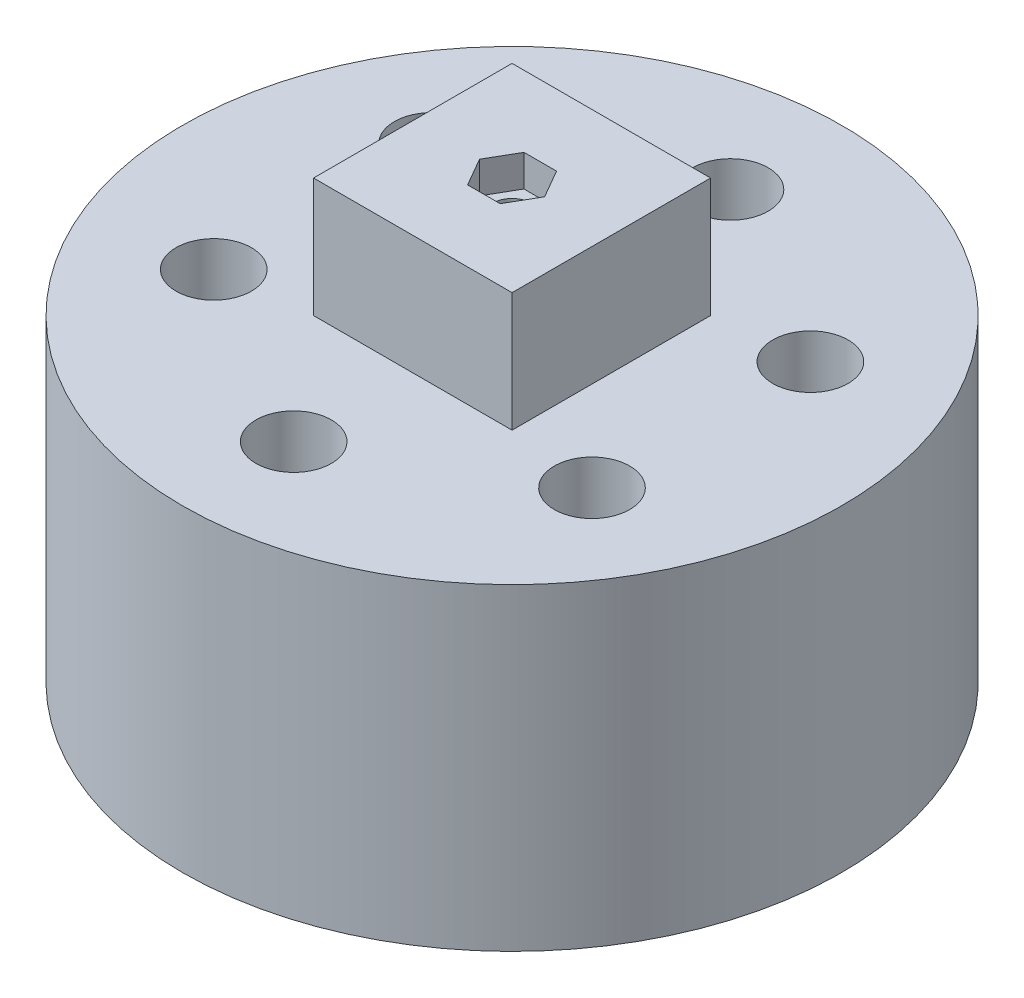
ISO-10303-21;
HEADER;
FILE_DESCRIPTION(('STEP AP214'),'2;1');
FILE_NAME('part.step','',(''),(''),'','','');
FILE_SCHEMA(('AUTOMOTIVE_DESIGN { 1 0 10303 214 1 1 1 1 }'));
ENDSEC;
DATA;
#1=APPLICATION_CONTEXT('core data for automotive mechanical design processes');
#2=APPLICATION_PROTOCOL_DEFINITION('international standard','automotive_design',2000,#1);
#3=PRODUCT_CONTEXT('',#1,'mechanical');
#4=PRODUCT('Part','Part','',(#3));
#5=PRODUCT_RELATED_PRODUCT_CATEGORY('part','',(#4));
#6=PRODUCT_DEFINITION_FORMATION('','',#4);
#7=PRODUCT_DEFINITION_CONTEXT('part definition',#1,'design');
#8=PRODUCT_DEFINITION('design','',#6,#7);
#9=PRODUCT_DEFINITION_SHAPE('','',#8);
#10=(LENGTH_UNIT() NAMED_UNIT(*) SI_UNIT(.MILLI.,.METRE.));
#11=(NAMED_UNIT(*) PLANE_ANGLE_UNIT() SI_UNIT($,.RADIAN.));
#12=(NAMED_UNIT(*) SI_UNIT($,.STERADIAN.) SOLID_ANGLE_UNIT());
#13=UNCERTAINTY_MEASURE_WITH_UNIT(LENGTH_MEASURE(1.E-05),#10,'distance_accuracy_value','');
#14=(GEOMETRIC_REPRESENTATION_CONTEXT(3) GLOBAL_UNCERTAINTY_ASSIGNED_CONTEXT((#13)) GLOBAL_UNIT_ASSIGNED_CONTEXT((#10,
#11,#12)) REPRESENTATION_CONTEXT('',''));
#15=CARTESIAN_POINT('',(0.,0.,0.));
#16=DIRECTION('',(0.,0.,1.));
#17=DIRECTION('',(1.,0.,0.));
#18=AXIS2_PLACEMENT_3D('',#15,#16,#17);
#19=CARTESIAN_POINT('',(0.,0.,0.));
#20=DIRECTION('',(0.,1.,0.));
#21=DIRECTION('',(0.,0.,1.));
#22=AXIS2_PLACEMENT_3D('',#19,#20,#21);
#23=CYLINDRICAL_SURFACE('',#22,2.5);
#24=CARTESIAN_POINT('',(0.,47.,0.));
#25=DIRECTION('',(0.,-1.,0.));
#26=DIRECTION('',(0.,0.,-1.));
#27=AXIS2_PLACEMENT_3D('',#24,#25,#26);
#28=CIRCLE('',#27,2.5);
#29=CARTESIAN_POINT('',(0.,47.,-2.5));
#30=VERTEX_POINT('',#29);
#31=EDGE_CURVE('E173',#30,#30,#28,.F.);
#32=ORIENTED_EDGE('',*,*,#31,.F.);
#33=EDGE_LOOP('',(#32));
#34=FACE_BOUND('',#33,.T.);
#35=CARTESIAN_POINT('',(0.,51.,0.));
#36=DIRECTION('',(0.,1.,0.));
#37=DIRECTION('',(0.,0.,1.));
#38=AXIS2_PLACEMENT_3D('',#35,#36,#37);
#39=CIRCLE('',#38,2.5);
#40=CARTESIAN_POINT('',(0.,51.,2.5));
#41=VERTEX_POINT('',#40);
#42=EDGE_CURVE('E38',#41,#41,#39,.F.);
#43=ORIENTED_EDGE('',*,*,#42,.F.);
#44=EDGE_LOOP('',(#43));
#45=FACE_BOUND('',#44,.T.);
#46=ADVANCED_FACE('F34',(#34,#45),#23,.F.);
#47=CARTESIAN_POINT('',(0.,40.,0.));
#48=DIRECTION('',(0.,1.,0.));
#49=DIRECTION('',(0.,0.,1.));
#50=AXIS2_PLACEMENT_3D('',#47,#48,#49);
#51=PLANE('',#50);
#52=CARTESIAN_POINT('',(0.,40.,0.));
#53=DIRECTION('',(0.,1.,0.));
#54=DIRECTION('',(0.,0.,1.));
#55=AXIS2_PLACEMENT_3D('',#52,#53,#54);
#56=CIRCLE('',#55,41.5);
#57=CARTESIAN_POINT('',(0.,40.,41.5));
#58=VERTEX_POINT('',#57);
#59=EDGE_CURVE('E12',#58,#58,#56,.T.);
#60=ORIENTED_EDGE('',*,*,#59,.T.);
#61=EDGE_LOOP('',(#60));
#62=FACE_BOUND('',#61,.T.);
#63=CARTESIAN_POINT('',(0.,40.,-27.5));
#64=DIRECTION('',(0.,1.,0.));
#65=DIRECTION('',(0.,0.,1.));
#66=AXIS2_PLACEMENT_3D('',#63,#64,#65);
#67=CIRCLE('',#66,4.75);
#68=CARTESIAN_POINT('',(0.,40.,-22.75));
#69=VERTEX_POINT('',#68);
#70=EDGE_CURVE('E238',#69,#69,#67,.T.);
#71=ORIENTED_EDGE('',*,*,#70,.F.);
#72=EDGE_LOOP('',(#71));
#73=FACE_BOUND('',#72,.T.);
#74=CARTESIAN_POINT('',(23.8156986040728,40.,-13.7500000000014));
#75=DIRECTION('',(0.,1.,0.));
#76=DIRECTION('',(0.,0.,1.));
#77=AXIS2_PLACEMENT_3D('',#74,#75,#76);
#78=CIRCLE('',#77,4.75);
#79=CARTESIAN_POINT('',(23.8156986040728,40.,-9.00000000000135));
#80=VERTEX_POINT('',#79);
#81=EDGE_CURVE('E231',#80,#80,#78,.T.);
#82=ORIENTED_EDGE('',*,*,#81,.F.);
#83=EDGE_LOOP('',(#82));
#84=FACE_BOUND('',#83,.T.);
#85=CARTESIAN_POINT('',(23.8156986040744,40.,13.7499999999986));
#86=DIRECTION('',(0.,1.,0.));
#87=DIRECTION('',(0.,0.,1.));
#88=AXIS2_PLACEMENT_3D('',#85,#86,#87);
#89=CIRCLE('',#88,4.75);
#90=CARTESIAN_POINT('',(23.8156986040744,40.,18.4999999999986));
#91=VERTEX_POINT('',#90);
#92=EDGE_CURVE('E224',#91,#91,#89,.T.);
#93=ORIENTED_EDGE('',*,*,#92,.F.);
#94=EDGE_LOOP('',(#93));
#95=FACE_BOUND('',#94,.T.);
#96=CARTESIAN_POINT('',(3.11965247994913E-12,40.,27.5));
#97=DIRECTION('',(0.,1.,0.));
#98=DIRECTION('',(0.,0.,1.));
#99=AXIS2_PLACEMENT_3D('',#96,#97,#98);
#100=CIRCLE('',#99,4.75);
#101=CARTESIAN_POINT('',(3.11965247994913E-12,40.,32.25));
#102=VERTEX_POINT('',#101);
#103=EDGE_CURVE('E217',#102,#102,#100,.T.);
#104=ORIENTED_EDGE('',*,*,#103,.F.);
#105=EDGE_LOOP('',(#104));
#106=FACE_BOUND('',#105,.T.);
#107=CARTESIAN_POINT('',(-23.8156986040697,40.,13.7500000000014));
#108=DIRECTION('',(0.,1.,0.));
#109=DIRECTION('',(0.,0.,1.));
#110=AXIS2_PLACEMENT_3D('',#107,#108,#109);
#111=CIRCLE('',#110,4.75);
#112=CARTESIAN_POINT('',(-23.8156986040697,40.,18.5000000000014));
#113=VERTEX_POINT('',#112);
#114=EDGE_CURVE('E210',#113,#113,#111,.T.);
#115=ORIENTED_EDGE('',*,*,#114,.F.);
#116=EDGE_LOOP('',(#115));
#117=FACE_BOUND('',#116,.T.);
#118=CARTESIAN_POINT('',(-23.8156986040713,40.,-13.7499999999986));
#119=DIRECTION('',(0.,1.,0.));
#120=DIRECTION('',(0.,0.,1.));
#121=AXIS2_PLACEMENT_3D('',#118,#119,#120);
#122=CIRCLE('',#121,4.75);
#123=CARTESIAN_POINT('',(-23.8156986040713,40.,-8.99999999999863));
#124=VERTEX_POINT('',#123);
#125=EDGE_CURVE('E203',#124,#124,#122,.T.);
#126=ORIENTED_EDGE('',*,*,#125,.F.);
#127=EDGE_LOOP('',(#126));
#128=FACE_BOUND('',#127,.T.);
#129=DIRECTION('',(1.,0.,0.));
#130=VECTOR('',#129,1.);
#131=CARTESIAN_POINT('',(12.5,40.,12.5));
#132=LINE('',#131,#130);
#133=CARTESIAN_POINT('',(-12.5,40.,12.5));
#134=VERTEX_POINT('',#133);
#135=CARTESIAN_POINT('',(12.5,40.,12.5));
#136=VERTEX_POINT('',#135);
#137=EDGE_CURVE('E190',#134,#136,#132,.T.);
#138=ORIENTED_EDGE('',*,*,#137,.F.);
#139=DIRECTION('',(0.,0.,1.));
#140=VECTOR('',#139,1.);
#141=CARTESIAN_POINT('',(-12.5,40.,12.5));
#142=LINE('',#141,#140);
#143=CARTESIAN_POINT('',(-12.5,40.,-12.5));
#144=VERTEX_POINT('',#143);
#145=EDGE_CURVE('E176',#144,#134,#142,.T.);
#146=ORIENTED_EDGE('',*,*,#145,.F.);
#147=DIRECTION('',(-1.,0.,0.));
#148=VECTOR('',#147,1.);
#149=CARTESIAN_POINT('',(12.5,40.,-12.5));
#150=LINE('',#149,#148);
#151=CARTESIAN_POINT('',(12.5,40.,-12.5));
#152=VERTEX_POINT('',#151);
#153=EDGE_CURVE('E181',#152,#144,#150,.T.);
#154=ORIENTED_EDGE('',*,*,#153,.F.);
#155=DIRECTION('',(0.,0.,-1.));
#156=VECTOR('',#155,1.);
#157=CARTESIAN_POINT('',(12.5,40.,12.5));
#158=LINE('',#157,#156);
#159=EDGE_CURVE('E192',#136,#152,#158,.T.);
#160=ORIENTED_EDGE('',*,*,#159,.F.);
#161=EDGE_LOOP('',(#138,#146,#154,#160));
#162=FACE_BOUND('',#161,.T.);
#163=ADVANCED_FACE('F283',(#62,#73,#84,#95,#106,#117,#128,#162),#51,.T.);
#164=CARTESIAN_POINT('',(-23.8156986040709,0.,-13.749999999998));
#165=DIRECTION('',(0.,1.,0.));
#166=DIRECTION('',(0.,0.,1.));
#167=AXIS2_PLACEMENT_3D('',#164,#165,#166);
#168=CYLINDRICAL_SURFACE('',#167,2.05);
#169=CARTESIAN_POINT('',(-23.8156986040709,0.,-13.749999999998));
#170=DIRECTION('',(0.,1.,0.));
#171=DIRECTION('',(0.,0.,1.));
#172=AXIS2_PLACEMENT_3D('',#169,#170,#171);
#173=CIRCLE('',#172,2.05);
#174=CARTESIAN_POINT('',(-23.8156986040709,0.,-11.699999999998));
#175=VERTEX_POINT('',#174);
#176=EDGE_CURVE('E245',#175,#175,#173,.T.);
#177=ORIENTED_EDGE('',*,*,#176,.F.);
#178=EDGE_LOOP('',(#177));
#179=FACE_BOUND('',#178,.T.);
#180=CARTESIAN_POINT('',(-23.8156986040709,3.,-13.749999999998));
#181=DIRECTION('',(0.,1.,0.));
#182=DIRECTION('',(0.,0.,1.));
#183=AXIS2_PLACEMENT_3D('',#180,#181,#182);
#184=CIRCLE('',#183,2.05);
#185=CARTESIAN_POINT('',(-23.8156986040709,3.,-11.699999999998));
#186=VERTEX_POINT('',#185);
#187=EDGE_CURVE('E209',#186,#186,#184,.F.);
#188=ORIENTED_EDGE('',*,*,#187,.F.);
#189=EDGE_LOOP('',(#188));
#190=FACE_BOUND('',#189,.T.);
#191=ADVANCED_FACE('F291',(#179,#190),#168,.F.);
#192=CARTESIAN_POINT('',(-23.8156986040685,0.,13.750000000002));
#193=DIRECTION('',(0.,1.,0.));
#194=DIRECTION('',(0.,0.,1.));
#195=AXIS2_PLACEMENT_3D('',#192,#193,#194);
#196=CYLINDRICAL_SURFACE('',#195,2.05);
#197=CARTESIAN_POINT('',(-23.8156986040685,0.,13.750000000002));
#198=DIRECTION('',(0.,1.,0.));
#199=DIRECTION('',(0.,0.,1.));
#200=AXIS2_PLACEMENT_3D('',#197,#198,#199);
#201=CIRCLE('',#200,2.05);
#202=CARTESIAN_POINT('',(-23.8156986040685,0.,15.800000000002));
#203=VERTEX_POINT('',#202);
#204=EDGE_CURVE('E248',#203,#203,#201,.T.);
#205=ORIENTED_EDGE('',*,*,#204,.F.);
#206=EDGE_LOOP('',(#205));
#207=FACE_BOUND('',#206,.T.);
#208=CARTESIAN_POINT('',(-23.8156986040685,3.,13.750000000002));
#209=DIRECTION('',(0.,1.,0.));
#210=DIRECTION('',(0.,0.,1.));
#211=AXIS2_PLACEMENT_3D('',#208,#209,#210);
#212=CIRCLE('',#211,2.05);
#213=CARTESIAN_POINT('',(-23.8156986040685,3.,15.800000000002));
#214=VERTEX_POINT('',#213);
#215=EDGE_CURVE('E216',#214,#214,#212,.F.);
#216=ORIENTED_EDGE('',*,*,#215,.F.);
#217=EDGE_LOOP('',(#216));
#218=FACE_BOUND('',#217,.T.);
#219=ADVANCED_FACE('F373',(#207,#218),#196,.F.);
#220=CARTESIAN_POINT('',(4.68284649862135E-12,0.,27.5));
#221=DIRECTION('',(0.,1.,0.));
#222=DIRECTION('',(0.,0.,1.));
#223=AXIS2_PLACEMENT_3D('',#220,#221,#222);
#224=CYLINDRICAL_SURFACE('',#223,2.05);
#225=CARTESIAN_POINT('',(4.68284649862135E-12,0.,27.5));
#226=DIRECTION('',(0.,1.,0.));
#227=DIRECTION('',(0.,0.,1.));
#228=AXIS2_PLACEMENT_3D('',#225,#226,#227);
#229=CIRCLE('',#228,2.05);
#230=CARTESIAN_POINT('',(4.68284649862135E-12,0.,29.55));
#231=VERTEX_POINT('',#230);
#232=EDGE_CURVE('E251',#231,#231,#229,.T.);
#233=ORIENTED_EDGE('',*,*,#232,.F.);
#234=EDGE_LOOP('',(#233));
#235=FACE_BOUND('',#234,.T.);
#236=CARTESIAN_POINT('',(4.68284649862135E-12,3.,27.5));
#237=DIRECTION('',(0.,1.,0.));
#238=DIRECTION('',(0.,0.,1.));
#239=AXIS2_PLACEMENT_3D('',#236,#237,#238);
#240=CIRCLE('',#239,2.05);
#241=CARTESIAN_POINT('',(4.68284649862135E-12,3.,29.55));
#242=VERTEX_POINT('',#241);
#243=EDGE_CURVE('E223',#242,#242,#240,.F.);
#244=ORIENTED_EDGE('',*,*,#243,.F.);
#245=EDGE_LOOP('',(#244));
#246=FACE_BOUND('',#245,.T.);
#247=ADVANCED_FACE('F377',(#235,#246),#224,.F.);
#248=CARTESIAN_POINT('',(23.8156986040756,0.,13.749999999998));
#249=DIRECTION('',(0.,1.,0.));
#250=DIRECTION('',(0.,0.,1.));
#251=AXIS2_PLACEMENT_3D('',#248,#249,#250);
#252=CYLINDRICAL_SURFACE('',#251,2.05);
#253=CARTESIAN_POINT('',(23.8156986040756,0.,13.749999999998));
#254=DIRECTION('',(0.,1.,0.));
#255=DIRECTION('',(0.,0.,1.));
#256=AXIS2_PLACEMENT_3D('',#253,#254,#255);
#257=CIRCLE('',#256,2.05);
#258=CARTESIAN_POINT('',(23.8156986040756,0.,15.799999999998));
#259=VERTEX_POINT('',#258);
#260=EDGE_CURVE('E254',#259,#259,#257,.T.);
#261=ORIENTED_EDGE('',*,*,#260,.F.);
#262=EDGE_LOOP('',(#261));
#263=FACE_BOUND('',#262,.T.);
#264=CARTESIAN_POINT('',(23.8156986040756,3.,13.749999999998));
#265=DIRECTION('',(0.,1.,0.));
#266=DIRECTION('',(0.,0.,1.));
#267=AXIS2_PLACEMENT_3D('',#264,#265,#266);
#268=CIRCLE('',#267,2.05);
#269=CARTESIAN_POINT('',(23.8156986040756,3.,15.799999999998));
#270=VERTEX_POINT('',#269);
#271=EDGE_CURVE('E230',#270,#270,#268,.F.);
#272=ORIENTED_EDGE('',*,*,#271,.F.);
#273=EDGE_LOOP('',(#272));
#274=FACE_BOUND('',#273,.T.);
#275=ADVANCED_FACE('F381',(#263,#274),#252,.F.);
#276=CARTESIAN_POINT('',(23.8156986040732,0.,-13.750000000002));
#277=DIRECTION('',(0.,1.,0.));
#278=DIRECTION('',(0.,0.,1.));
#279=AXIS2_PLACEMENT_3D('',#276,#277,#278);
#280=CYLINDRICAL_SURFACE('',#279,2.05);
#281=CARTESIAN_POINT('',(23.8156986040732,0.,-13.750000000002));
#282=DIRECTION('',(0.,1.,0.));
#283=DIRECTION('',(0.,0.,1.));
#284=AXIS2_PLACEMENT_3D('',#281,#282,#283);
#285=CIRCLE('',#284,2.05);
#286=CARTESIAN_POINT('',(23.8156986040732,0.,-11.700000000002));
#287=VERTEX_POINT('',#286);
#288=EDGE_CURVE('E257',#287,#287,#285,.T.);
#289=ORIENTED_EDGE('',*,*,#288,.F.);
#290=EDGE_LOOP('',(#289));
#291=FACE_BOUND('',#290,.T.);
#292=CARTESIAN_POINT('',(23.8156986040732,3.,-13.750000000002));
#293=DIRECTION('',(0.,1.,0.));
#294=DIRECTION('',(0.,0.,1.));
#295=AXIS2_PLACEMENT_3D('',#292,#293,#294);
#296=CIRCLE('',#295,2.05);
#297=CARTESIAN_POINT('',(23.8156986040732,3.,-11.700000000002));
#298=VERTEX_POINT('',#297);
#299=EDGE_CURVE('E237',#298,#298,#296,.F.);
#300=ORIENTED_EDGE('',*,*,#299,.F.);
#301=EDGE_LOOP('',(#300));
#302=FACE_BOUND('',#301,.T.);
#303=ADVANCED_FACE('F385',(#291,#302),#280,.F.);
#304=CARTESIAN_POINT('',(0.,0.,-27.5));
#305=DIRECTION('',(0.,1.,0.));
#306=DIRECTION('',(0.,0.,1.));
#307=AXIS2_PLACEMENT_3D('',#304,#305,#306);
#308=CYLINDRICAL_SURFACE('',#307,2.05);
#309=CARTESIAN_POINT('',(0.,0.,-27.5));
#310=DIRECTION('',(0.,1.,0.));
#311=DIRECTION('',(0.,0.,1.));
#312=AXIS2_PLACEMENT_3D('',#309,#310,#311);
#313=CIRCLE('',#312,2.05);
#314=CARTESIAN_POINT('',(0.,0.,-25.45));
#315=VERTEX_POINT('',#314);
#316=EDGE_CURVE('E260',#315,#315,#313,.T.);
#317=ORIENTED_EDGE('',*,*,#316,.F.);
#318=EDGE_LOOP('',(#317));
#319=FACE_BOUND('',#318,.T.);
#320=CARTESIAN_POINT('',(0.,3.,-27.5));
#321=DIRECTION('',(0.,1.,0.));
#322=DIRECTION('',(0.,0.,1.));
#323=AXIS2_PLACEMENT_3D('',#320,#321,#322);
#324=CIRCLE('',#323,2.05);
#325=CARTESIAN_POINT('',(0.,3.,-25.45));
#326=VERTEX_POINT('',#325);
#327=EDGE_CURVE('E244',#326,#326,#324,.F.);
#328=ORIENTED_EDGE('',*,*,#327,.F.);
#329=EDGE_LOOP('',(#328));
#330=FACE_BOUND('',#329,.T.);
#331=ADVANCED_FACE('F389',(#319,#330),#308,.F.);
#332=CARTESIAN_POINT('',(0.,40.,0.));
#333=DIRECTION('',(0.,-1.,0.));
#334=DIRECTION('',(0.,0.,-1.));
#335=AXIS2_PLACEMENT_3D('',#332,#333,#334);
#336=CYLINDRICAL_SURFACE('',#335,41.5);
#337=ORIENTED_EDGE('',*,*,#59,.F.);
#338=EDGE_LOOP('',(#337));
#339=FACE_BOUND('',#338,.T.);
#340=CARTESIAN_POINT('',(0.,0.,0.));
#341=DIRECTION('',(0.,1.,0.));
#342=DIRECTION('',(0.,0.,1.));
#343=AXIS2_PLACEMENT_3D('',#340,#341,#342);
#344=CIRCLE('',#343,41.5);
#345=CARTESIAN_POINT('',(0.,0.,41.5));
#346=VERTEX_POINT('',#345);
#347=EDGE_CURVE('E43',#346,#346,#344,.T.);
#348=ORIENTED_EDGE('',*,*,#347,.T.);
#349=EDGE_LOOP('',(#348));
#350=FACE_BOUND('',#349,.T.);
#351=ADVANCED_FACE('F36',(#339,#350),#336,.T.);
#352=CARTESIAN_POINT('',(0.,0.,0.));
#353=DIRECTION('',(0.,1.,0.));
#354=DIRECTION('',(0.,0.,1.));
#355=AXIS2_PLACEMENT_3D('',#352,#353,#354);
#356=PLANE('',#355);
#357=CARTESIAN_POINT('',(0.,0.,0.));
#358=DIRECTION('',(0.,-1.,0.));
#359=DIRECTION('',(0.,0.,-1.));
#360=AXIS2_PLACEMENT_3D('',#357,#358,#359);
#361=CIRCLE('',#360,4.5);
#362=CARTESIAN_POINT('',(0.,0.,-4.5));
#363=VERTEX_POINT('',#362);
#364=EDGE_CURVE('E172',#363,#363,#361,.T.);
#365=ORIENTED_EDGE('',*,*,#364,.F.);
#366=EDGE_LOOP('',(#365));
#367=FACE_BOUND('',#366,.T.);
#368=ORIENTED_EDGE('',*,*,#176,.T.);
#369=EDGE_LOOP('',(#368));
#370=FACE_BOUND('',#369,.T.);
#371=ORIENTED_EDGE('',*,*,#204,.T.);
#372=EDGE_LOOP('',(#371));
#373=FACE_BOUND('',#372,.T.);
#374=ORIENTED_EDGE('',*,*,#232,.T.);
#375=EDGE_LOOP('',(#374));
#376=FACE_BOUND('',#375,.T.);
#377=ORIENTED_EDGE('',*,*,#260,.T.);
#378=EDGE_LOOP('',(#377));
#379=FACE_BOUND('',#378,.T.);
#380=ORIENTED_EDGE('',*,*,#288,.T.);
#381=EDGE_LOOP('',(#380));
#382=FACE_BOUND('',#381,.T.);
#383=ORIENTED_EDGE('',*,*,#316,.T.);
#384=EDGE_LOOP('',(#383));
#385=FACE_BOUND('',#384,.T.);
#386=ORIENTED_EDGE('',*,*,#347,.F.);
#387=EDGE_LOOP('',(#386));
#388=FACE_BOUND('',#387,.T.);
#389=ADVANCED_FACE('F366',(#367,#370,#373,#376,#379,#382,#385,#388),#356,.F.);
#390=CARTESIAN_POINT('',(0.,3.,0.));
#391=DIRECTION('',(0.,1.,0.));
#392=DIRECTION('',(0.,0.,1.));
#393=AXIS2_PLACEMENT_3D('',#390,#391,#392);
#394=PLANE('',#393);
#395=CARTESIAN_POINT('',(0.,3.,-27.5));
#396=DIRECTION('',(0.,1.,0.));
#397=DIRECTION('',(0.,0.,1.));
#398=AXIS2_PLACEMENT_3D('',#395,#396,#397);
#399=CIRCLE('',#398,4.75);
#400=CARTESIAN_POINT('',(0.,3.,-22.75));
#401=VERTEX_POINT('',#400);
#402=EDGE_CURVE('E241',#401,#401,#399,.F.);
#403=ORIENTED_EDGE('',*,*,#402,.F.);
#404=EDGE_LOOP('',(#403));
#405=FACE_BOUND('',#404,.T.);
#406=ORIENTED_EDGE('',*,*,#327,.T.);
#407=EDGE_LOOP('',(#406));
#408=FACE_BOUND('',#407,.T.);
#409=ADVANCED_FACE('F363',(#405,#408),#394,.T.);
#410=CARTESIAN_POINT('',(0.,-13.4350288425444,-27.5));
#411=DIRECTION('',(0.,1.,0.));
#412=DIRECTION('',(0.,0.,1.));
#413=AXIS2_PLACEMENT_3D('',#410,#411,#412);
#414=CYLINDRICAL_SURFACE('',#413,4.75);
#415=ORIENTED_EDGE('',*,*,#402,.T.);
#416=EDGE_LOOP('',(#415));
#417=FACE_BOUND('',#416,.T.);
#418=ORIENTED_EDGE('',*,*,#70,.T.);
#419=EDGE_LOOP('',(#418));
#420=FACE_BOUND('',#419,.T.);
#421=ADVANCED_FACE('F358',(#417,#420),#414,.F.);
#422=CARTESIAN_POINT('',(0.,3.,0.));
#423=DIRECTION('',(0.,1.,0.));
#424=DIRECTION('',(0.,0.,1.));
#425=AXIS2_PLACEMENT_3D('',#422,#423,#424);
#426=PLANE('',#425);
#427=CARTESIAN_POINT('',(23.8156986040728,3.,-13.7500000000014));
#428=DIRECTION('',(0.,1.,0.));
#429=DIRECTION('',(0.,0.,1.));
#430=AXIS2_PLACEMENT_3D('',#427,#428,#429);
#431=CIRCLE('',#430,4.75);
#432=CARTESIAN_POINT('',(23.8156986040728,3.,-9.00000000000135));
#433=VERTEX_POINT('',#432);
#434=EDGE_CURVE('E234',#433,#433,#431,.F.);
#435=ORIENTED_EDGE('',*,*,#434,.F.);
#436=EDGE_LOOP('',(#435));
#437=FACE_BOUND('',#436,.T.);
#438=ORIENTED_EDGE('',*,*,#299,.T.);
#439=EDGE_LOOP('',(#438));
#440=FACE_BOUND('',#439,.T.);
#441=ADVANCED_FACE('F355',(#437,#440),#426,.T.);
#442=CARTESIAN_POINT('',(23.8156986040728,-13.4350288425444,-13.7500000000014));
#443=DIRECTION('',(0.,1.,0.));
#444=DIRECTION('',(0.,0.,1.));
#445=AXIS2_PLACEMENT_3D('',#442,#443,#444);
#446=CYLINDRICAL_SURFACE('',#445,4.75);
#447=ORIENTED_EDGE('',*,*,#434,.T.);
#448=EDGE_LOOP('',(#447));
#449=FACE_BOUND('',#448,.T.);
#450=ORIENTED_EDGE('',*,*,#81,.T.);
#451=EDGE_LOOP('',(#450));
#452=FACE_BOUND('',#451,.T.);
#453=ADVANCED_FACE('F350',(#449,#452),#446,.F.);
#454=CARTESIAN_POINT('',(0.,3.,0.));
#455=DIRECTION('',(0.,1.,0.));
#456=DIRECTION('',(0.,0.,1.));
#457=AXIS2_PLACEMENT_3D('',#454,#455,#456);
#458=PLANE('',#457);
#459=CARTESIAN_POINT('',(23.8156986040744,3.,13.7499999999986));
#460=DIRECTION('',(0.,1.,0.));
#461=DIRECTION('',(0.,0.,1.));
#462=AXIS2_PLACEMENT_3D('',#459,#460,#461);
#463=CIRCLE('',#462,4.75);
#464=CARTESIAN_POINT('',(23.8156986040744,3.,18.4999999999986));
#465=VERTEX_POINT('',#464);
#466=EDGE_CURVE('E227',#465,#465,#463,.F.);
#467=ORIENTED_EDGE('',*,*,#466,.F.);
#468=EDGE_LOOP('',(#467));
#469=FACE_BOUND('',#468,.T.);
#470=ORIENTED_EDGE('',*,*,#271,.T.);
#471=EDGE_LOOP('',(#470));
#472=FACE_BOUND('',#471,.T.);
#473=ADVANCED_FACE('F347',(#469,#472),#458,.T.);
#474=CARTESIAN_POINT('',(23.8156986040744,-13.4350288425444,13.7499999999986));
#475=DIRECTION('',(0.,1.,0.));
#476=DIRECTION('',(0.,0.,1.));
#477=AXIS2_PLACEMENT_3D('',#474,#475,#476);
#478=CYLINDRICAL_SURFACE('',#477,4.75);
#479=ORIENTED_EDGE('',*,*,#466,.T.);
#480=EDGE_LOOP('',(#479));
#481=FACE_BOUND('',#480,.T.);
#482=ORIENTED_EDGE('',*,*,#92,.T.);
#483=EDGE_LOOP('',(#482));
#484=FACE_BOUND('',#483,.T.);
#485=ADVANCED_FACE('F342',(#481,#484),#478,.F.);
#486=CARTESIAN_POINT('',(0.,3.,0.));
#487=DIRECTION('',(0.,1.,0.));
#488=DIRECTION('',(0.,0.,1.));
#489=AXIS2_PLACEMENT_3D('',#486,#487,#488);
#490=PLANE('',#489);
#491=CARTESIAN_POINT('',(3.11965247994913E-12,3.,27.5));
#492=DIRECTION('',(0.,1.,0.));
#493=DIRECTION('',(0.,0.,1.));
#494=AXIS2_PLACEMENT_3D('',#491,#492,#493);
#495=CIRCLE('',#494,4.75);
#496=CARTESIAN_POINT('',(3.11965247994913E-12,3.,32.25));
#497=VERTEX_POINT('',#496);
#498=EDGE_CURVE('E220',#497,#497,#495,.F.);
#499=ORIENTED_EDGE('',*,*,#498,.F.);
#500=EDGE_LOOP('',(#499));
#501=FACE_BOUND('',#500,.T.);
#502=ORIENTED_EDGE('',*,*,#243,.T.);
#503=EDGE_LOOP('',(#502));
#504=FACE_BOUND('',#503,.T.);
#505=ADVANCED_FACE('F339',(#501,#504),#490,.T.);
#506=CARTESIAN_POINT('',(3.11965247994913E-12,-13.4350288425444,27.5));
#507=DIRECTION('',(0.,1.,0.));
#508=DIRECTION('',(0.,0.,1.));
#509=AXIS2_PLACEMENT_3D('',#506,#507,#508);
#510=CYLINDRICAL_SURFACE('',#509,4.75);
#511=ORIENTED_EDGE('',*,*,#498,.T.);
#512=EDGE_LOOP('',(#511));
#513=FACE_BOUND('',#512,.T.);
#514=ORIENTED_EDGE('',*,*,#103,.T.);
#515=EDGE_LOOP('',(#514));
#516=FACE_BOUND('',#515,.T.);
#517=ADVANCED_FACE('F334',(#513,#516),#510,.F.);
#518=CARTESIAN_POINT('',(0.,3.,0.));
#519=DIRECTION('',(0.,1.,0.));
#520=DIRECTION('',(0.,0.,1.));
#521=AXIS2_PLACEMENT_3D('',#518,#519,#520);
#522=PLANE('',#521);
#523=CARTESIAN_POINT('',(-23.8156986040697,3.,13.7500000000014));
#524=DIRECTION('',(0.,1.,0.));
#525=DIRECTION('',(0.,0.,1.));
#526=AXIS2_PLACEMENT_3D('',#523,#524,#525);
#527=CIRCLE('',#526,4.75);
#528=CARTESIAN_POINT('',(-23.8156986040697,3.,18.5000000000014));
#529=VERTEX_POINT('',#528);
#530=EDGE_CURVE('E213',#529,#529,#527,.F.);
#531=ORIENTED_EDGE('',*,*,#530,.F.);
#532=EDGE_LOOP('',(#531));
#533=FACE_BOUND('',#532,.T.);
#534=ORIENTED_EDGE('',*,*,#215,.T.);
#535=EDGE_LOOP('',(#534));
#536=FACE_BOUND('',#535,.T.);
#537=ADVANCED_FACE('F331',(#533,#536),#522,.T.);
#538=CARTESIAN_POINT('',(-23.8156986040697,-13.4350288425444,13.7500000000014));
#539=DIRECTION('',(0.,1.,0.));
#540=DIRECTION('',(0.,0.,1.));
#541=AXIS2_PLACEMENT_3D('',#538,#539,#540);
#542=CYLINDRICAL_SURFACE('',#541,4.75);
#543=ORIENTED_EDGE('',*,*,#530,.T.);
#544=EDGE_LOOP('',(#543));
#545=FACE_BOUND('',#544,.T.);
#546=ORIENTED_EDGE('',*,*,#114,.T.);
#547=EDGE_LOOP('',(#546));
#548=FACE_BOUND('',#547,.T.);
#549=ADVANCED_FACE('F326',(#545,#548),#542,.F.);
#550=CARTESIAN_POINT('',(0.,3.,0.));
#551=DIRECTION('',(0.,1.,0.));
#552=DIRECTION('',(0.,0.,1.));
#553=AXIS2_PLACEMENT_3D('',#550,#551,#552);
#554=PLANE('',#553);
#555=CARTESIAN_POINT('',(-23.8156986040713,3.,-13.7499999999986));
#556=DIRECTION('',(0.,1.,0.));
#557=DIRECTION('',(0.,0.,1.));
#558=AXIS2_PLACEMENT_3D('',#555,#556,#557);
#559=CIRCLE('',#558,4.75);
#560=CARTESIAN_POINT('',(-23.8156986040713,3.,-8.99999999999863));
#561=VERTEX_POINT('',#560);
#562=EDGE_CURVE('E206',#561,#561,#559,.F.);
#563=ORIENTED_EDGE('',*,*,#562,.F.);
#564=EDGE_LOOP('',(#563));
#565=FACE_BOUND('',#564,.T.);
#566=ORIENTED_EDGE('',*,*,#187,.T.);
#567=EDGE_LOOP('',(#566));
#568=FACE_BOUND('',#567,.T.);
#569=ADVANCED_FACE('F323',(#565,#568),#554,.T.);
#570=CARTESIAN_POINT('',(-23.8156986040713,-13.4350288425444,-13.7499999999986));
#571=DIRECTION('',(0.,1.,0.));
#572=DIRECTION('',(0.,0.,1.));
#573=AXIS2_PLACEMENT_3D('',#570,#571,#572);
#574=CYLINDRICAL_SURFACE('',#573,4.75);
#575=ORIENTED_EDGE('',*,*,#562,.T.);
#576=EDGE_LOOP('',(#575));
#577=FACE_BOUND('',#576,.T.);
#578=ORIENTED_EDGE('',*,*,#125,.T.);
#579=EDGE_LOOP('',(#578));
#580=FACE_BOUND('',#579,.T.);
#581=ADVANCED_FACE('F321',(#577,#580),#574,.F.);
#582=CARTESIAN_POINT('',(-12.5,55.,12.5));
#583=DIRECTION('',(1.,0.,0.));
#584=DIRECTION('',(0.,0.,-1.));
#585=AXIS2_PLACEMENT_3D('',#582,#583,#584);
#586=PLANE('',#585);
#587=ORIENTED_EDGE('',*,*,#145,.T.);
#588=DIRECTION('',(0.,-1.,0.));
#589=VECTOR('',#588,1.);
#590=CARTESIAN_POINT('',(-12.5,55.,12.5));
#591=LINE('',#590,#589);
#592=CARTESIAN_POINT('',(-12.5,55.,12.5));
#593=VERTEX_POINT('',#592);
#594=EDGE_CURVE('E201',#593,#134,#591,.T.);
#595=ORIENTED_EDGE('',*,*,#594,.F.);
#596=DIRECTION('',(0.,0.,1.));
#597=VECTOR('',#596,1.);
#598=CARTESIAN_POINT('',(-12.5,55.,12.5));
#599=LINE('',#598,#597);
#600=CARTESIAN_POINT('',(-12.5,55.,-12.5));
#601=VERTEX_POINT('',#600);
#602=EDGE_CURVE('E177',#601,#593,#599,.T.);
#603=ORIENTED_EDGE('',*,*,#602,.F.);
#604=DIRECTION('',(0.,-1.,0.));
#605=VECTOR('',#604,1.);
#606=CARTESIAN_POINT('',(-12.5,55.,-12.5));
#607=LINE('',#606,#605);
#608=EDGE_CURVE('E187',#601,#144,#607,.T.);
#609=ORIENTED_EDGE('',*,*,#608,.T.);
#610=EDGE_LOOP('',(#587,#595,#603,#609));
#611=FACE_BOUND('',#610,.T.);
#612=ADVANCED_FACE('F317',(#611),#586,.F.);
#613=CARTESIAN_POINT('',(12.5,55.,12.5));
#614=DIRECTION('',(0.,0.,-1.));
#615=DIRECTION('',(-1.,0.,0.));
#616=AXIS2_PLACEMENT_3D('',#613,#614,#615);
#617=PLANE('',#616);
#618=ORIENTED_EDGE('',*,*,#137,.T.);
#619=DIRECTION('',(0.,-1.,0.));
#620=VECTOR('',#619,1.);
#621=CARTESIAN_POINT('',(12.5,55.,12.5));
#622=LINE('',#621,#620);
#623=CARTESIAN_POINT('',(12.5,55.,12.5));
#624=VERTEX_POINT('',#623);
#625=EDGE_CURVE('E198',#624,#136,#622,.T.);
#626=ORIENTED_EDGE('',*,*,#625,.F.);
#627=DIRECTION('',(1.,0.,0.));
#628=VECTOR('',#627,1.);
#629=CARTESIAN_POINT('',(12.5,55.,12.5));
#630=LINE('',#629,#628);
#631=EDGE_CURVE('E180',#593,#624,#630,.T.);
#632=ORIENTED_EDGE('',*,*,#631,.F.);
#633=ORIENTED_EDGE('',*,*,#594,.T.);
#634=EDGE_LOOP('',(#618,#626,#632,#633));
#635=FACE_BOUND('',#634,.T.);
#636=ADVANCED_FACE('F313',(#635),#617,.F.);
#637=CARTESIAN_POINT('',(12.5,55.,12.5));
#638=DIRECTION('',(-1.,0.,0.));
#639=DIRECTION('',(0.,0.,1.));
#640=AXIS2_PLACEMENT_3D('',#637,#638,#639);
#641=PLANE('',#640);
#642=ORIENTED_EDGE('',*,*,#159,.T.);
#643=DIRECTION('',(0.,-1.,0.));
#644=VECTOR('',#643,1.);
#645=CARTESIAN_POINT('',(12.5,55.,-12.5));
#646=LINE('',#645,#644);
#647=CARTESIAN_POINT('',(12.5,55.,-12.5));
#648=VERTEX_POINT('',#647);
#649=EDGE_CURVE('E59',#648,#152,#646,.T.);
#650=ORIENTED_EDGE('',*,*,#649,.F.);
#651=DIRECTION('',(0.,0.,-1.));
#652=VECTOR('',#651,1.);
#653=CARTESIAN_POINT('',(12.5,55.,12.5));
#654=LINE('',#653,#652);
#655=EDGE_CURVE('E183',#624,#648,#654,.T.);
#656=ORIENTED_EDGE('',*,*,#655,.F.);
#657=ORIENTED_EDGE('',*,*,#625,.T.);
#658=EDGE_LOOP('',(#642,#650,#656,#657));
#659=FACE_BOUND('',#658,.T.);
#660=ADVANCED_FACE('F310',(#659),#641,.F.);
#661=CARTESIAN_POINT('',(12.5,55.,-12.5));
#662=DIRECTION('',(0.,0.,1.));
#663=DIRECTION('',(1.,0.,0.));
#664=AXIS2_PLACEMENT_3D('',#661,#662,#663);
#665=PLANE('',#664);
#666=ORIENTED_EDGE('',*,*,#153,.T.);
#667=ORIENTED_EDGE('',*,*,#608,.F.);
#668=DIRECTION('',(-1.,0.,0.));
#669=VECTOR('',#668,1.);
#670=CARTESIAN_POINT('',(12.5,55.,-12.5));
#671=LINE('',#670,#669);
#672=EDGE_CURVE('E185',#648,#601,#671,.T.);
#673=ORIENTED_EDGE('',*,*,#672,.F.);
#674=ORIENTED_EDGE('',*,*,#649,.T.);
#675=EDGE_LOOP('',(#666,#667,#673,#674));
#676=FACE_BOUND('',#675,.T.);
#677=ADVANCED_FACE('F306',(#676),#665,.F.);
#678=CARTESIAN_POINT('',(0.,55.,0.));
#679=DIRECTION('',(0.,1.,0.));
#680=DIRECTION('',(0.,0.,1.));
#681=AXIS2_PLACEMENT_3D('',#678,#679,#680);
#682=PLANE('',#681);
#683=DIRECTION('',(-0.5,0.,0.866025403784438));
#684=VECTOR('',#683,1.);
#685=CARTESIAN_POINT('',(-2.04959345562317,55.,-3.55));
#686=LINE('',#685,#684);
#687=CARTESIAN_POINT('',(-2.04959345562317,55.,-3.55));
#688=VERTEX_POINT('',#687);
#689=CARTESIAN_POINT('',(-4.09918691124634,55.,0.));
#690=VERTEX_POINT('',#689);
#691=EDGE_CURVE('E51',#688,#690,#686,.T.);
#692=ORIENTED_EDGE('',*,*,#691,.F.);
#693=DIRECTION('',(-1.,0.,0.));
#694=VECTOR('',#693,1.);
#695=CARTESIAN_POINT('',(2.04959345562317,55.,-3.55));
#696=LINE('',#695,#694);
#697=CARTESIAN_POINT('',(2.04959345562317,55.,-3.55));
#698=VERTEX_POINT('',#697);
#699=EDGE_CURVE('E136',#698,#688,#696,.T.);
#700=ORIENTED_EDGE('',*,*,#699,.F.);
#701=DIRECTION('',(-0.5,0.,-0.866025403784438));
#702=VECTOR('',#701,1.);
#703=CARTESIAN_POINT('',(4.09918691124634,55.,0.));
#704=LINE('',#703,#702);
#705=CARTESIAN_POINT('',(4.09918691124634,55.,0.));
#706=VERTEX_POINT('',#705);
#707=EDGE_CURVE('E139',#706,#698,#704,.T.);
#708=ORIENTED_EDGE('',*,*,#707,.F.);
#709=DIRECTION('',(0.5,0.,-0.866025403784439));
#710=VECTOR('',#709,1.);
#711=CARTESIAN_POINT('',(2.04959345562317,55.,3.55));
#712=LINE('',#711,#710);
#713=CARTESIAN_POINT('',(2.04959345562317,55.,3.55));
#714=VERTEX_POINT('',#713);
#715=EDGE_CURVE('E155',#714,#706,#712,.T.);
#716=ORIENTED_EDGE('',*,*,#715,.F.);
#717=DIRECTION('',(1.,0.,0.));
#718=VECTOR('',#717,1.);
#719=CARTESIAN_POINT('',(-2.04959345562317,55.,3.55));
#720=LINE('',#719,#718);
#721=CARTESIAN_POINT('',(-2.04959345562317,55.,3.55));
#722=VERTEX_POINT('',#721);
#723=EDGE_CURVE('E152',#722,#714,#720,.T.);
#724=ORIENTED_EDGE('',*,*,#723,.F.);
#725=DIRECTION('',(0.5,0.,0.866025403784438));
#726=VECTOR('',#725,1.);
#727=CARTESIAN_POINT('',(-4.09918691124635,55.,0.));
#728=LINE('',#727,#726);
#729=EDGE_CURVE('E150',#690,#722,#728,.T.);
#730=ORIENTED_EDGE('',*,*,#729,.F.);
#731=EDGE_LOOP('',(#692,#700,#708,#716,#724,#730));
#732=FACE_BOUND('',#731,.T.);
#733=ORIENTED_EDGE('',*,*,#602,.T.);
#734=ORIENTED_EDGE('',*,*,#631,.T.);
#735=ORIENTED_EDGE('',*,*,#655,.T.);
#736=ORIENTED_EDGE('',*,*,#672,.T.);
#737=EDGE_LOOP('',(#733,#734,#735,#736));
#738=FACE_BOUND('',#737,.T.);
#739=ADVANCED_FACE('F302',(#732,#738),#682,.T.);
#740=CARTESIAN_POINT('',(0.,67.7279220613578,0.));
#741=DIRECTION('',(0.,-1.,0.));
#742=DIRECTION('',(0.,0.,-1.));
#743=AXIS2_PLACEMENT_3D('',#740,#741,#742);
#744=CYLINDRICAL_SURFACE('',#743,4.5);
#745=ORIENTED_EDGE('',*,*,#364,.T.);
#746=EDGE_LOOP('',(#745));
#747=FACE_BOUND('',#746,.T.);
#748=CARTESIAN_POINT('',(0.,45.,0.));
#749=DIRECTION('',(0.,-1.,0.));
#750=DIRECTION('',(0.,0.,-1.));
#751=AXIS2_PLACEMENT_3D('',#748,#749,#750);
#752=CIRCLE('',#751,4.5);
#753=CARTESIAN_POINT('',(0.,45.,-4.5));
#754=VERTEX_POINT('',#753);
#755=EDGE_CURVE('E169',#754,#754,#752,.T.);
#756=ORIENTED_EDGE('',*,*,#755,.F.);
#757=EDGE_LOOP('',(#756));
#758=FACE_BOUND('',#757,.T.);
#759=ADVANCED_FACE('F300',(#747,#758),#744,.F.);
#760=CARTESIAN_POINT('',(0.,45.,0.));
#761=DIRECTION('',(0.,-1.,0.));
#762=DIRECTION('',(0.,0.,-1.));
#763=AXIS2_PLACEMENT_3D('',#760,#761,#762);
#764=CONICAL_SURFACE('',#763,4.5,0.78539816339745);
#765=ORIENTED_EDGE('',*,*,#31,.T.);
#766=EDGE_LOOP('',(#765));
#767=FACE_BOUND('',#766,.T.);
#768=ORIENTED_EDGE('',*,*,#755,.T.);
#769=EDGE_LOOP('',(#768));
#770=FACE_BOUND('',#769,.T.);
#771=ADVANCED_FACE('F297',(#767,#770),#764,.F.);
#772=CARTESIAN_POINT('',(0.,51.,0.));
#773=DIRECTION('',(0.,1.,0.));
#774=DIRECTION('',(0.,0.,1.));
#775=AXIS2_PLACEMENT_3D('',#772,#773,#774);
#776=PLANE('',#775);
#777=DIRECTION('',(-0.5,0.,0.866025403784438));
#778=VECTOR('',#777,1.);
#779=CARTESIAN_POINT('',(-2.04959345562317,51.,-3.55));
#780=LINE('',#779,#778);
#781=CARTESIAN_POINT('',(-2.04959345562317,51.,-3.55));
#782=VERTEX_POINT('',#781);
#783=CARTESIAN_POINT('',(-4.09918691124635,51.,0.));
#784=VERTEX_POINT('',#783);
#785=EDGE_CURVE('E116',#782,#784,#780,.T.);
#786=ORIENTED_EDGE('',*,*,#785,.T.);
#787=DIRECTION('',(0.5,0.,0.866025403784438));
#788=VECTOR('',#787,1.);
#789=CARTESIAN_POINT('',(-4.09918691124635,51.,0.));
#790=LINE('',#789,#788);
#791=CARTESIAN_POINT('',(-2.04959345562317,51.,3.55));
#792=VERTEX_POINT('',#791);
#793=EDGE_CURVE('E125',#784,#792,#790,.T.);
#794=ORIENTED_EDGE('',*,*,#793,.T.);
#795=DIRECTION('',(1.,0.,0.));
#796=VECTOR('',#795,1.);
#797=CARTESIAN_POINT('',(-2.04959345562317,51.,3.55));
#798=LINE('',#797,#796);
#799=CARTESIAN_POINT('',(2.04959345562317,51.,3.55));
#800=VERTEX_POINT('',#799);
#801=EDGE_CURVE('E130',#792,#800,#798,.T.);
#802=ORIENTED_EDGE('',*,*,#801,.T.);
#803=DIRECTION('',(0.5,0.,-0.866025403784439));
#804=VECTOR('',#803,1.);
#805=CARTESIAN_POINT('',(2.04959345562317,51.,3.55));
#806=LINE('',#805,#804);
#807=CARTESIAN_POINT('',(4.09918691124634,51.,0.));
#808=VERTEX_POINT('',#807);
#809=EDGE_CURVE('E143',#800,#808,#806,.T.);
#810=ORIENTED_EDGE('',*,*,#809,.T.);
#811=DIRECTION('',(-0.5,0.,-0.866025403784438));
#812=VECTOR('',#811,1.);
#813=CARTESIAN_POINT('',(4.09918691124634,51.,0.));
#814=LINE('',#813,#812);
#815=CARTESIAN_POINT('',(2.04959345562317,51.,-3.55));
#816=VERTEX_POINT('',#815);
#817=EDGE_CURVE('E146',#808,#816,#814,.T.);
#818=ORIENTED_EDGE('',*,*,#817,.T.);
#819=DIRECTION('',(-1.,0.,0.));
#820=VECTOR('',#819,1.);
#821=CARTESIAN_POINT('',(2.04959345562317,51.,-3.55));
#822=LINE('',#821,#820);
#823=EDGE_CURVE('E122',#816,#782,#822,.T.);
#824=ORIENTED_EDGE('',*,*,#823,.T.);
#825=EDGE_LOOP('',(#786,#794,#802,#810,#818,#824));
#826=FACE_BOUND('',#825,.T.);
#827=ORIENTED_EDGE('',*,*,#42,.T.);
#828=EDGE_LOOP('',(#827));
#829=FACE_BOUND('',#828,.T.);
#830=ADVANCED_FACE('F132',(#826,#829),#776,.T.);
#831=CARTESIAN_POINT('',(-2.04959345562317,51.,-3.55));
#832=DIRECTION('',(-0.866025403784439,0.,-0.5));
#833=DIRECTION('',(-0.5,0.,0.866025403784439));
#834=AXIS2_PLACEMENT_3D('',#831,#832,#833);
#835=PLANE('',#834);
#836=ORIENTED_EDGE('',*,*,#691,.T.);
#837=DIRECTION('',(0.,1.,0.));
#838=VECTOR('',#837,1.);
#839=CARTESIAN_POINT('',(-4.09918691124635,51.,0.));
#840=LINE('',#839,#838);
#841=EDGE_CURVE('E112',#784,#690,#840,.T.);
#842=ORIENTED_EDGE('',*,*,#841,.F.);
#843=ORIENTED_EDGE('',*,*,#785,.F.);
#844=DIRECTION('',(0.,1.,0.));
#845=VECTOR('',#844,1.);
#846=CARTESIAN_POINT('',(-2.04959345562317,51.,-3.55));
#847=LINE('',#846,#845);
#848=EDGE_CURVE('E160',#782,#688,#847,.T.);
#849=ORIENTED_EDGE('',*,*,#848,.T.);
#850=EDGE_LOOP('',(#836,#842,#843,#849));
#851=FACE_BOUND('',#850,.T.);
#852=ADVANCED_FACE('F114',(#851),#835,.F.);
#853=CARTESIAN_POINT('',(2.04959345562317,51.,-3.55));
#854=DIRECTION('',(0.,0.,-1.));
#855=DIRECTION('',(-1.,0.,0.));
#856=AXIS2_PLACEMENT_3D('',#853,#854,#855);
#857=PLANE('',#856);
#858=ORIENTED_EDGE('',*,*,#699,.T.);
#859=ORIENTED_EDGE('',*,*,#848,.F.);
#860=ORIENTED_EDGE('',*,*,#823,.F.);
#861=DIRECTION('',(0.,1.,0.));
#862=VECTOR('',#861,1.);
#863=CARTESIAN_POINT('',(2.04959345562317,51.,-3.55));
#864=LINE('',#863,#862);
#865=EDGE_CURVE('E162',#816,#698,#864,.T.);
#866=ORIENTED_EDGE('',*,*,#865,.T.);
#867=EDGE_LOOP('',(#858,#859,#860,#866));
#868=FACE_BOUND('',#867,.T.);
#869=ADVANCED_FACE('F566',(#868),#857,.F.);
#870=CARTESIAN_POINT('',(4.09918691124634,51.,0.));
#871=DIRECTION('',(0.866025403784439,0.,-0.5));
#872=DIRECTION('',(-0.5,0.,-0.866025403784438));
#873=AXIS2_PLACEMENT_3D('',#870,#871,#872);
#874=PLANE('',#873);
#875=ORIENTED_EDGE('',*,*,#707,.T.);
#876=ORIENTED_EDGE('',*,*,#865,.F.);
#877=ORIENTED_EDGE('',*,*,#817,.F.);
#878=DIRECTION('',(0.,1.,0.));
#879=VECTOR('',#878,1.);
#880=CARTESIAN_POINT('',(4.09918691124634,51.,0.));
#881=LINE('',#880,#879);
#882=EDGE_CURVE('E164',#808,#706,#881,.T.);
#883=ORIENTED_EDGE('',*,*,#882,.T.);
#884=EDGE_LOOP('',(#875,#876,#877,#883));
#885=FACE_BOUND('',#884,.T.);
#886=ADVANCED_FACE('F574',(#885),#874,.F.);
#887=CARTESIAN_POINT('',(2.04959345562317,51.,3.55));
#888=DIRECTION('',(0.866025403784439,0.,0.5));
#889=DIRECTION('',(0.5,0.,-0.866025403784439));
#890=AXIS2_PLACEMENT_3D('',#887,#888,#889);
#891=PLANE('',#890);
#892=ORIENTED_EDGE('',*,*,#715,.T.);
#893=ORIENTED_EDGE('',*,*,#882,.F.);
#894=ORIENTED_EDGE('',*,*,#809,.F.);
#895=DIRECTION('',(0.,1.,0.));
#896=VECTOR('',#895,1.);
#897=CARTESIAN_POINT('',(2.04959345562317,51.,3.55));
#898=LINE('',#897,#896);
#899=EDGE_CURVE('E166',#800,#714,#898,.T.);
#900=ORIENTED_EDGE('',*,*,#899,.T.);
#901=EDGE_LOOP('',(#892,#893,#894,#900));
#902=FACE_BOUND('',#901,.T.);
#903=ADVANCED_FACE('F584',(#902),#891,.F.);
#904=CARTESIAN_POINT('',(-2.04959345562317,51.,3.55));
#905=DIRECTION('',(0.,0.,1.));
#906=DIRECTION('',(1.,0.,0.));
#907=AXIS2_PLACEMENT_3D('',#904,#905,#906);
#908=PLANE('',#907);
#909=ORIENTED_EDGE('',*,*,#723,.T.);
#910=ORIENTED_EDGE('',*,*,#899,.F.);
#911=ORIENTED_EDGE('',*,*,#801,.F.);
#912=DIRECTION('',(0.,1.,0.));
#913=VECTOR('',#912,1.);
#914=CARTESIAN_POINT('',(-2.04959345562317,51.,3.55));
#915=LINE('',#914,#913);
#916=EDGE_CURVE('E121',#792,#722,#915,.T.);
#917=ORIENTED_EDGE('',*,*,#916,.T.);
#918=EDGE_LOOP('',(#909,#910,#911,#917));
#919=FACE_BOUND('',#918,.T.);
#920=ADVANCED_FACE('F594',(#919),#908,.F.);
#921=CARTESIAN_POINT('',(-4.09918691124635,51.,0.));
#922=DIRECTION('',(-0.866025403784438,0.,0.5));
#923=DIRECTION('',(0.5,0.,0.866025403784438));
#924=AXIS2_PLACEMENT_3D('',#921,#922,#923);
#925=PLANE('',#924);
#926=ORIENTED_EDGE('',*,*,#729,.T.);
#927=ORIENTED_EDGE('',*,*,#916,.F.);
#928=ORIENTED_EDGE('',*,*,#793,.F.);
#929=ORIENTED_EDGE('',*,*,#841,.T.);
#930=EDGE_LOOP('',(#926,#927,#928,#929));
#931=FACE_BOUND('',#930,.T.);
#932=ADVANCED_FACE('F126',(#931),#925,.F.);
#933=CLOSED_SHELL('',(#46,#163,#191,#219,#247,#275,#303,#331,#351,#389,#409,#421,#441,#453,#473,
#485,#505,#517,#537,#549,#569,#581,#612,#636,#660,#677,#739,#759,#771,#830,#852,#869,#886,#903,
#920,#932));
#934=MANIFOLD_SOLID_BREP('B2',#933);
#935=ADVANCED_BREP_SHAPE_REPRESENTATION('',(#18,#934),#14);
#936=SHAPE_DEFINITION_REPRESENTATION(#9,#935);
ENDSEC;
END-ISO-10303-21;
